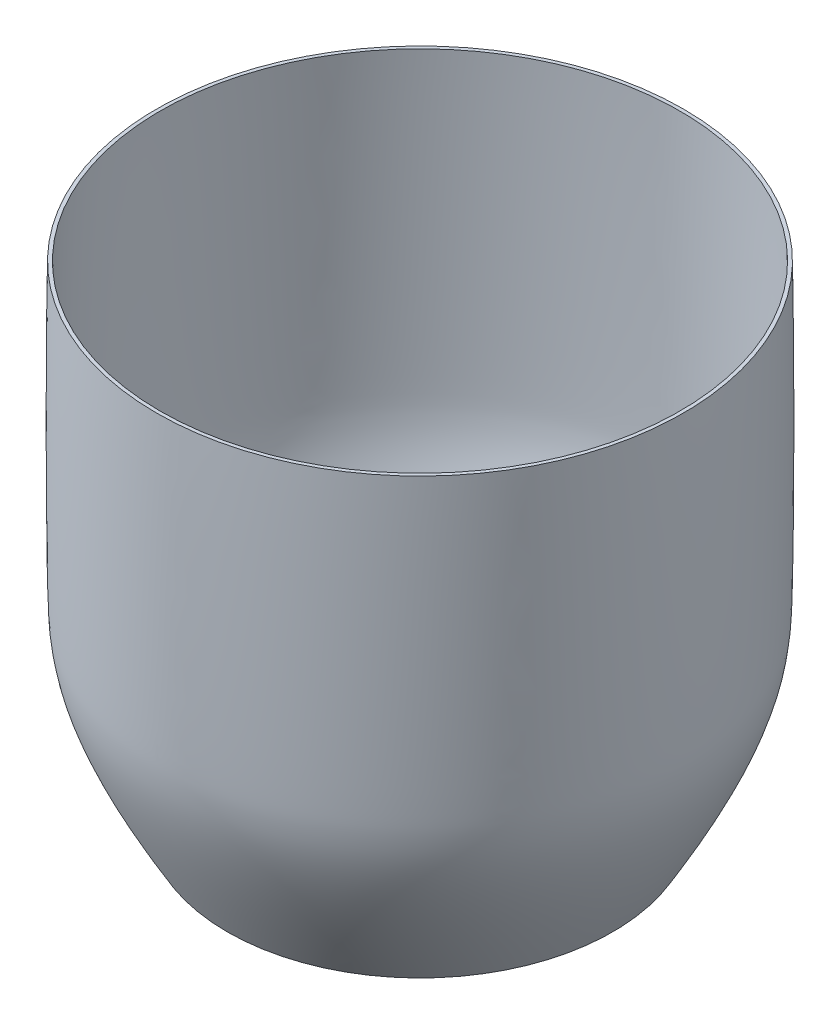
ISO-10303-21;
HEADER;
FILE_DESCRIPTION(('STEP AP214'),'2;1');
FILE_NAME('part.step','',(''),(''),'','','');
FILE_SCHEMA(('AUTOMOTIVE_DESIGN { 1 0 10303 214 1 1 1 1 }'));
ENDSEC;
DATA;
#1=APPLICATION_CONTEXT('core data for automotive mechanical design processes');
#2=APPLICATION_PROTOCOL_DEFINITION('international standard','automotive_design',2000,#1);
#3=PRODUCT_CONTEXT('',#1,'mechanical');
#4=PRODUCT('Part','Part','',(#3));
#5=PRODUCT_RELATED_PRODUCT_CATEGORY('part','',(#4));
#6=PRODUCT_DEFINITION_FORMATION('','',#4);
#7=PRODUCT_DEFINITION_CONTEXT('part definition',#1,'design');
#8=PRODUCT_DEFINITION('design','',#6,#7);
#9=PRODUCT_DEFINITION_SHAPE('','',#8);
#10=(LENGTH_UNIT() NAMED_UNIT(*) SI_UNIT(.MILLI.,.METRE.));
#11=(NAMED_UNIT(*) PLANE_ANGLE_UNIT() SI_UNIT($,.RADIAN.));
#12=(NAMED_UNIT(*) SI_UNIT($,.STERADIAN.) SOLID_ANGLE_UNIT());
#13=UNCERTAINTY_MEASURE_WITH_UNIT(LENGTH_MEASURE(1.E-05),#10,'distance_accuracy_value','');
#14=(GEOMETRIC_REPRESENTATION_CONTEXT(3) GLOBAL_UNCERTAINTY_ASSIGNED_CONTEXT((#13)) GLOBAL_UNIT_ASSIGNED_CONTEXT((#10,
#11,#12)) REPRESENTATION_CONTEXT('',''));
#15=CARTESIAN_POINT('',(0.,0.,0.));
#16=DIRECTION('',(0.,0.,1.));
#17=DIRECTION('',(1.,0.,0.));
#18=AXIS2_PLACEMENT_3D('',#15,#16,#17);
#19=CARTESIAN_POINT('',(46.,0.,0.));
#20=CARTESIAN_POINT('',(50.9933971001775,43.4224413494784,0.));
#21=CARTESIAN_POINT('',(74.4192310372411,29.0667025173688,0.));
#22=CARTESIAN_POINT('',(75.887608064845,-30.1706648424878,0.));
#23=CARTESIAN_POINT('',(75.613452988558,-93.0299903677548,0.));
#24=CARTESIAN_POINT('',(74.5221700971514,-105.89674932675,0.));
#25=CARTESIAN_POINT('',(71.8537440984771,-121.07553247764,0.));
#26=CARTESIAN_POINT('',(54.9999999999995,-150.000000000001,0.));
#27=B_SPLINE_CURVE_WITH_KNOTS('',3,(#19,#20,#21,#22,#23,#24,#25,#26),.UNSPECIFIED.,.F.,.F.,(4,1,
1,1,1,4),(0.,0.332423256181795,0.386421074120653,0.677937348688572,0.742939194708605,1.),.UNSPECIFIED.);
#28=CARTESIAN_POINT('',(0.,0.,0.));
#29=DIRECTION('',(0.,1.,0.));
#30=AXIS1_PLACEMENT('',#28,#29);
#31=SURFACE_OF_REVOLUTION('',#27,#30);
#32=CARTESIAN_POINT('',(0.,-10.,0.));
#33=DIRECTION('',(0.,1.,0.));
#34=DIRECTION('',(0.,0.,1.));
#35=AXIS2_PLACEMENT_3D('',#32,#33,#34);
#36=CIRCLE('',#35,75.3497459295597);
#37=CARTESIAN_POINT('',(0.,-10.,75.3497459295597));
#38=VERTEX_POINT('',#37);
#39=EDGE_CURVE('E44',#38,#38,#36,.T.);
#40=ORIENTED_EDGE('',*,*,#39,.T.);
#41=EDGE_LOOP('',(#40));
#42=FACE_BOUND('',#41,.T.);
#43=CARTESIAN_POINT('',(0.,-150.,0.));
#44=DIRECTION('',(0.,1.,0.));
#45=DIRECTION('',(0.,0.,1.));
#46=AXIS2_PLACEMENT_3D('',#43,#44,#45);
#47=CIRCLE('',#46,55.);
#48=CARTESIAN_POINT('',(0.,-150.,55.));
#49=VERTEX_POINT('',#48);
#50=EDGE_CURVE('E10',#49,#49,#47,.T.);
#51=ORIENTED_EDGE('',*,*,#50,.F.);
#52=EDGE_LOOP('',(#51));
#53=FACE_BOUND('',#52,.T.);
#54=ADVANCED_FACE('F32',(#42,#53),#31,.T.);
#55=CARTESIAN_POINT('',(0.,-150.,0.));
#56=DIRECTION('',(0.,-1.,0.));
#57=DIRECTION('',(0.,0.,-1.));
#58=AXIS2_PLACEMENT_3D('',#55,#56,#57);
#59=CONICAL_SURFACE('',#58,55.,1.04320856541476);
#60=CARTESIAN_POINT('',(0.,-150.503450575864,0.));
#61=DIRECTION('',(0.,1.,0.));
#62=DIRECTION('',(0.,0.,1.));
#63=AXIS2_PLACEMENT_3D('',#60,#61,#62);
#64=CIRCLE('',#63,55.8640240260907);
#65=CARTESIAN_POINT('',(0.,-150.503450575864,55.8640240260907));
#66=VERTEX_POINT('',#65);
#67=EDGE_CURVE('E40',#66,#66,#64,.T.);
#68=ORIENTED_EDGE('',*,*,#67,.F.);
#69=EDGE_LOOP('',(#68));
#70=FACE_BOUND('',#69,.T.);
#71=ORIENTED_EDGE('',*,*,#50,.T.);
#72=EDGE_LOOP('',(#71));
#73=FACE_BOUND('',#72,.T.);
#74=ADVANCED_FACE('F62',(#70,#73),#59,.F.);
#75=CARTESIAN_POINT('',(55.8640240260907,-150.503450575864,0.));
#76=CARTESIAN_POINT('',(56.3674413967225,-149.639483536733,0.));
#77=CARTESIAN_POINT('',(57.3820729234915,-147.882500868379,0.));
#78=CARTESIAN_POINT('',(58.7966717420311,-145.386184344614,0.));
#79=CARTESIAN_POINT('',(60.1417972920296,-142.965951037677,0.));
#80=CARTESIAN_POINT('',(61.8330223049933,-139.859537439724,0.));
#81=CARTESIAN_POINT('',(63.7667458991814,-136.187722813188,0.));
#82=CARTESIAN_POINT('',(65.8149115108722,-132.107058319537,0.));
#83=CARTESIAN_POINT('',(67.6092640938333,-128.335514056452,0.));
#84=CARTESIAN_POINT('',(69.6871118841151,-123.698544356344,0.));
#85=CARTESIAN_POINT('',(71.7394629300752,-118.597826519355,0.));
#86=CARTESIAN_POINT('',(73.4735797637513,-113.466672248027,0.));
#87=CARTESIAN_POINT('',(74.6212970464148,-109.202041189307,0.));
#88=CARTESIAN_POINT('',(75.3257047501165,-105.691817603041,0.));
#89=CARTESIAN_POINT('',(75.7263895832879,-102.804562872018,0.));
#90=CARTESIAN_POINT('',(75.9803328683045,-100.516841802857,0.));
#91=CARTESIAN_POINT('',(76.1269913562216,-98.2132227866145,0.));
#92=CARTESIAN_POINT('',(76.2259514931766,-95.4746912257643,0.));
#93=CARTESIAN_POINT('',(76.3193410672417,-92.0172555258465,0.));
#94=CARTESIAN_POINT('',(76.4227503577199,-86.5039672084225,0.));
#95=CARTESIAN_POINT('',(76.5232615267945,-78.3121714102114,0.));
#96=CARTESIAN_POINT('',(76.6213248755253,-65.7622660470165,0.));
#97=CARTESIAN_POINT('',(76.659503219375,-51.4725999034286,0.));
#98=CARTESIAN_POINT('',(76.6240782171612,-36.8501212226987,0.));
#99=CARTESIAN_POINT('',(76.5596769019441,-26.0722694802569,0.));
#100=CARTESIAN_POINT('',(76.4454669070154,-15.8213064397733,0.));
#101=CARTESIAN_POINT('',(76.3111338938598,-6.50133901320443,0.));
#102=CARTESIAN_POINT('',(76.0065280546275,1.781881660534,0.));
#103=CARTESIAN_POINT('',(74.9082238266084,9.35443692093519,0.));
#104=CARTESIAN_POINT('',(72.9686708265153,16.0495087251773,0.));
#105=CARTESIAN_POINT('',(70.3840494909512,21.6591983005094,0.));
#106=CARTESIAN_POINT('',(67.2723103250638,25.9931854790252,0.));
#107=CARTESIAN_POINT('',(63.7354110127862,28.8559644256983,0.));
#108=CARTESIAN_POINT('',(59.775616351803,29.9447030911879,0.));
#109=CARTESIAN_POINT('',(55.7624382140691,28.7524001477026,0.));
#110=CARTESIAN_POINT('',(52.8225312756635,25.8907371048809,0.));
#111=CARTESIAN_POINT('',(50.7142617401397,22.4792021350868,0.));
#112=CARTESIAN_POINT('',(49.2607988775367,19.3273991966434,0.));
#113=CARTESIAN_POINT('',(47.9448914543985,15.556110412051,0.));
#114=CARTESIAN_POINT('',(46.9745867938303,11.8728444195555,0.));
#115=CARTESIAN_POINT('',(46.2821758023938,8.58727768742949,0.));
#116=CARTESIAN_POINT('',(45.8071090757114,5.95130273945141,0.));
#117=CARTESIAN_POINT('',(45.4494762225831,3.60453447361284,0.));
#118=CARTESIAN_POINT('',(45.1885177498488,1.64446051928665,0.));
#119=CARTESIAN_POINT('',(45.0648275699621,0.62104777640401,0.));
#120=CARTESIAN_POINT('',(45.0065471499391,0.114242875952816,0.));
#121=B_SPLINE_CURVE_WITH_KNOTS('',3,(#75,#76,#77,#78,#79,#80,#81,#82,#83,#84,#85,#86,#87,#88,
#89,#90,#91,#92,#93,#94,#95,#96,#97,#98,#99,#100,#101,#102,#103,#104,#105,#106,#107,#108,#109,
#110,#111,#112,#113,#114,#115,#116,#117,#118,#119,#120),.UNSPECIFIED.,.F.,.F.,(4,1,1,1,1,1,1,1,
1,1,1,1,1,1,1,1,1,1,1,1,1,1,1,1,1,1,1,1,1,1,1,1,1,1,1,1,1,1,1,1,1,1,1,4),(0.,0.0078125,0.015625,
0.0234375,0.03125,0.046875,0.0625,0.078125,0.09375,0.125,0.15625,0.1875,0.21875,0.25,0.28125,
0.3125,0.328125,0.34375,0.375,0.40625,0.4375,0.5,0.53125,0.5625,0.59375,0.625,0.65625,0.6875,
0.71875,0.75,0.78125,0.8125,0.84375,0.875,0.90625,0.921875,0.9375,0.953125,0.96875,0.9765625,
0.984375,0.9921875,0.99609375,1.),.UNSPECIFIED.);
#122=CARTESIAN_POINT('',(0.,0.,0.));
#123=DIRECTION('',(0.,1.,0.));
#124=AXIS1_PLACEMENT('',#122,#123);
#125=SURFACE_OF_REVOLUTION('',#121,#124);
#126=CARTESIAN_POINT('',(0.,-9.99999999999999,0.));
#127=DIRECTION('',(0.,1.,0.));
#128=DIRECTION('',(0.,0.,1.));
#129=AXIS2_PLACEMENT_3D('',#126,#127,#128);
#130=CIRCLE('',#129,76.3535567935194);
#131=CARTESIAN_POINT('',(0.,-9.99999999999999,76.3535567935194));
#132=VERTEX_POINT('',#131);
#133=EDGE_CURVE('E36',#132,#132,#130,.F.);
#134=ORIENTED_EDGE('',*,*,#133,.T.);
#135=EDGE_LOOP('',(#134));
#136=FACE_BOUND('',#135,.T.);
#137=ORIENTED_EDGE('',*,*,#67,.T.);
#138=EDGE_LOOP('',(#137));
#139=FACE_BOUND('',#138,.T.);
#140=ADVANCED_FACE('F58',(#136,#139),#125,.T.);
#141=CARTESIAN_POINT('',(-131.014798824303,-10.,-76.659503219375));
#142=DIRECTION('',(0.,-1.,0.));
#143=DIRECTION('',(0.,0.,-1.));
#144=AXIS2_PLACEMENT_3D('',#141,#142,#143);
#145=PLANE('',#144);
#146=ORIENTED_EDGE('',*,*,#133,.F.);
#147=EDGE_LOOP('',(#146));
#148=FACE_BOUND('',#147,.T.);
#149=ORIENTED_EDGE('',*,*,#39,.F.);
#150=EDGE_LOOP('',(#149));
#151=FACE_BOUND('',#150,.T.);
#152=ADVANCED_FACE('F61',(#148,#151),#145,.F.);
#153=CLOSED_SHELL('',(#54,#74,#140,#152));
#154=MANIFOLD_SOLID_BREP('B2',#153);
#155=ADVANCED_BREP_SHAPE_REPRESENTATION('',(#18,#154),#14);
#156=SHAPE_DEFINITION_REPRESENTATION(#9,#155);
ENDSEC;
END-ISO-10303-21;
